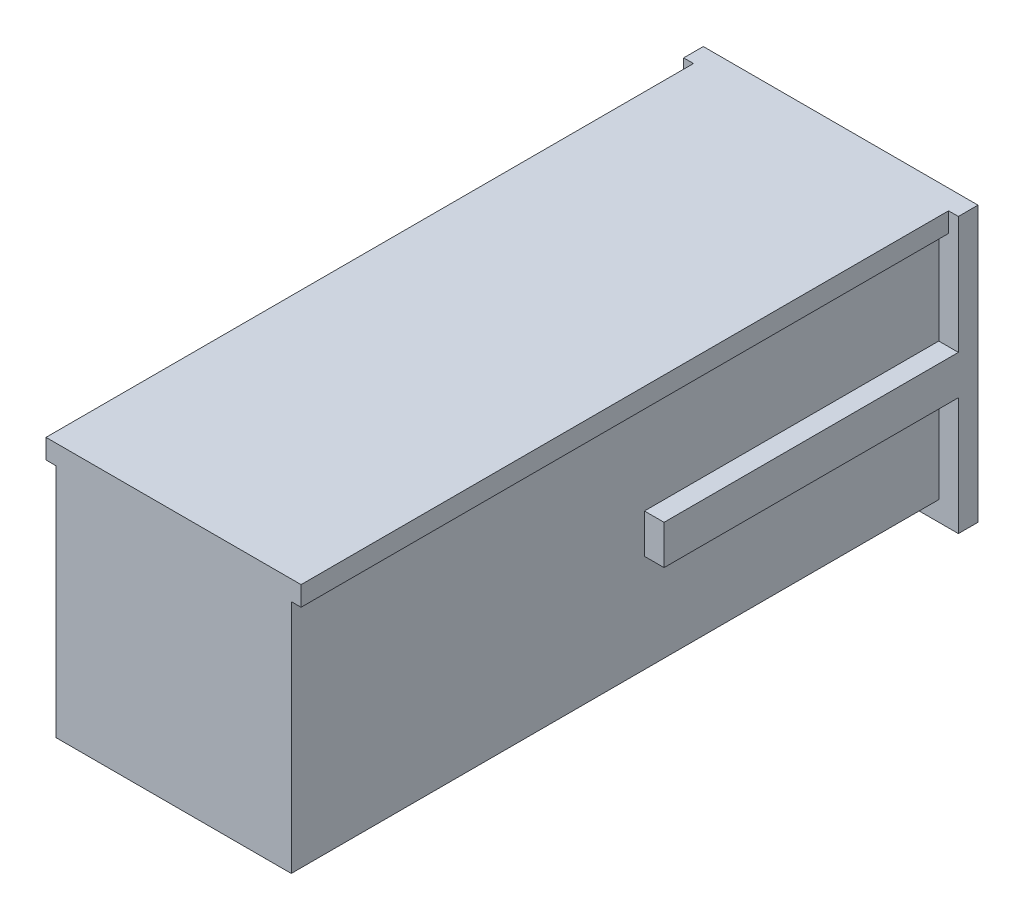
ISO-10303-21;
HEADER;
FILE_DESCRIPTION(('STEP AP214'),'2;1');
FILE_NAME('part.step','',(''),(''),'','','');
FILE_SCHEMA(('AUTOMOTIVE_DESIGN { 1 0 10303 214 1 1 1 1 }'));
ENDSEC;
DATA;
#1=APPLICATION_CONTEXT('core data for automotive mechanical design processes');
#2=APPLICATION_PROTOCOL_DEFINITION('international standard','automotive_design',2000,#1);
#3=PRODUCT_CONTEXT('',#1,'mechanical');
#4=PRODUCT('Part','Part','',(#3));
#5=PRODUCT_RELATED_PRODUCT_CATEGORY('part','',(#4));
#6=PRODUCT_DEFINITION_FORMATION('','',#4);
#7=PRODUCT_DEFINITION_CONTEXT('part definition',#1,'design');
#8=PRODUCT_DEFINITION('design','',#6,#7);
#9=PRODUCT_DEFINITION_SHAPE('','',#8);
#10=(LENGTH_UNIT() NAMED_UNIT(*) SI_UNIT(.MILLI.,.METRE.));
#11=(NAMED_UNIT(*) PLANE_ANGLE_UNIT() SI_UNIT($,.RADIAN.));
#12=(NAMED_UNIT(*) SI_UNIT($,.STERADIAN.) SOLID_ANGLE_UNIT());
#13=UNCERTAINTY_MEASURE_WITH_UNIT(LENGTH_MEASURE(1.E-05),#10,'distance_accuracy_value','');
#14=(GEOMETRIC_REPRESENTATION_CONTEXT(3) GLOBAL_UNCERTAINTY_ASSIGNED_CONTEXT((#13)) GLOBAL_UNIT_ASSIGNED_CONTEXT((#10,
#11,#12)) REPRESENTATION_CONTEXT('',''));
#15=CARTESIAN_POINT('',(0.,0.,0.));
#16=DIRECTION('',(0.,0.,1.));
#17=DIRECTION('',(1.,0.,0.));
#18=AXIS2_PLACEMENT_3D('',#15,#16,#17);
#19=CARTESIAN_POINT('',(300.,-300.,1700.));
#20=DIRECTION('',(-1.,0.,0.));
#21=DIRECTION('',(0.,0.,1.));
#22=AXIS2_PLACEMENT_3D('',#19,#20,#21);
#23=PLANE('',#22);
#24=DIRECTION('',(0.,-1.,0.));
#25=VECTOR('',#24,1.);
#26=CARTESIAN_POINT('',(300.,-300.,50.));
#27=LINE('',#26,#25);
#28=CARTESIAN_POINT('',(300.,300.,50.));
#29=VERTEX_POINT('',#28);
#30=CARTESIAN_POINT('',(300.,50.,50.));
#31=VERTEX_POINT('',#30);
#32=EDGE_CURVE('E189',#29,#31,#27,.T.);
#33=ORIENTED_EDGE('',*,*,#32,.F.);
#34=DIRECTION('',(0.,0.,-1.));
#35=VECTOR('',#34,1.);
#36=CARTESIAN_POINT('',(300.,300.,1700.));
#37=LINE('',#36,#35);
#38=CARTESIAN_POINT('',(300.,300.,1700.));
#39=VERTEX_POINT('',#38);
#40=EDGE_CURVE('E48',#39,#29,#37,.T.);
#41=ORIENTED_EDGE('',*,*,#40,.F.);
#42=DIRECTION('',(0.,1.,0.));
#43=VECTOR('',#42,1.);
#44=CARTESIAN_POINT('',(300.,-300.,1700.));
#45=LINE('',#44,#43);
#46=CARTESIAN_POINT('',(300.,-300.,1700.));
#47=VERTEX_POINT('',#46);
#48=EDGE_CURVE('E254',#47,#39,#45,.T.);
#49=ORIENTED_EDGE('',*,*,#48,.F.);
#50=DIRECTION('',(0.,0.,-1.));
#51=VECTOR('',#50,1.);
#52=CARTESIAN_POINT('',(300.,-300.,1700.));
#53=LINE('',#52,#51);
#54=CARTESIAN_POINT('',(300.,-300.,50.));
#55=VERTEX_POINT('',#54);
#56=EDGE_CURVE('E260',#47,#55,#53,.T.);
#57=ORIENTED_EDGE('',*,*,#56,.T.);
#58=CARTESIAN_POINT('',(300.,-50.,50.));
#59=VERTEX_POINT('',#58);
#60=EDGE_CURVE('E184',#59,#55,#27,.T.);
#61=ORIENTED_EDGE('',*,*,#60,.F.);
#62=DIRECTION('',(0.,0.,-1.));
#63=VECTOR('',#62,1.);
#64=CARTESIAN_POINT('',(300.,-50.,800.));
#65=LINE('',#64,#63);
#66=CARTESIAN_POINT('',(300.,-50.,800.));
#67=VERTEX_POINT('',#66);
#68=EDGE_CURVE('E224',#67,#59,#65,.T.);
#69=ORIENTED_EDGE('',*,*,#68,.F.);
#70=DIRECTION('',(0.,-1.,0.));
#71=VECTOR('',#70,1.);
#72=CARTESIAN_POINT('',(300.,-50.,800.));
#73=LINE('',#72,#71);
#74=CARTESIAN_POINT('',(300.,50.,800.));
#75=VERTEX_POINT('',#74);
#76=EDGE_CURVE('E215',#75,#67,#73,.T.);
#77=ORIENTED_EDGE('',*,*,#76,.F.);
#78=DIRECTION('',(0.,0.,-1.));
#79=VECTOR('',#78,1.);
#80=CARTESIAN_POINT('',(300.,50.,800.));
#81=LINE('',#80,#79);
#82=EDGE_CURVE('E227',#75,#31,#81,.T.);
#83=ORIENTED_EDGE('',*,*,#82,.T.);
#84=EDGE_LOOP('',(#33,#41,#49,#57,#61,#69,#77,#83));
#85=FACE_BOUND('',#84,.T.);
#86=ADVANCED_FACE('F41',(#85),#23,.F.);
#87=CARTESIAN_POINT('',(-300.,-300.,1700.));
#88=DIRECTION('',(1.,0.,0.));
#89=DIRECTION('',(0.,0.,-1.));
#90=AXIS2_PLACEMENT_3D('',#87,#88,#89);
#91=PLANE('',#90);
#92=DIRECTION('',(0.,1.,0.));
#93=VECTOR('',#92,1.);
#94=CARTESIAN_POINT('',(-300.,-300.,50.));
#95=LINE('',#94,#93);
#96=CARTESIAN_POINT('',(-300.,-300.,50.));
#97=VERTEX_POINT('',#96);
#98=CARTESIAN_POINT('',(-300.,300.,50.));
#99=VERTEX_POINT('',#98);
#100=EDGE_CURVE('E55',#97,#99,#95,.T.);
#101=ORIENTED_EDGE('',*,*,#100,.F.);
#102=DIRECTION('',(0.,0.,-1.));
#103=VECTOR('',#102,1.);
#104=CARTESIAN_POINT('',(-300.,-300.,1700.));
#105=LINE('',#104,#103);
#106=CARTESIAN_POINT('',(-300.,-300.,1700.));
#107=VERTEX_POINT('',#106);
#108=EDGE_CURVE('E262',#107,#97,#105,.T.);
#109=ORIENTED_EDGE('',*,*,#108,.F.);
#110=DIRECTION('',(0.,-1.,0.));
#111=VECTOR('',#110,1.);
#112=CARTESIAN_POINT('',(-300.,-300.,1700.));
#113=LINE('',#112,#111);
#114=CARTESIAN_POINT('',(-300.,300.,1700.));
#115=VERTEX_POINT('',#114);
#116=EDGE_CURVE('E256',#115,#107,#113,.T.);
#117=ORIENTED_EDGE('',*,*,#116,.F.);
#118=DIRECTION('',(0.,0.,-1.));
#119=VECTOR('',#118,1.);
#120=CARTESIAN_POINT('',(-300.,300.,1700.));
#121=LINE('',#120,#119);
#122=EDGE_CURVE('E264',#115,#99,#121,.T.);
#123=ORIENTED_EDGE('',*,*,#122,.T.);
#124=EDGE_LOOP('',(#101,#109,#117,#123));
#125=FACE_BOUND('',#124,.T.);
#126=ADVANCED_FACE('F307',(#125),#91,.F.);
#127=CARTESIAN_POINT('',(-300.,-300.,1700.));
#128=DIRECTION('',(0.,1.,0.));
#129=DIRECTION('',(0.,0.,1.));
#130=AXIS2_PLACEMENT_3D('',#127,#128,#129);
#131=PLANE('',#130);
#132=DIRECTION('',(-1.,0.,0.));
#133=VECTOR('',#132,1.);
#134=CARTESIAN_POINT('',(-300.,-300.,50.));
#135=LINE('',#134,#133);
#136=EDGE_CURVE('E62',#55,#97,#135,.T.);
#137=ORIENTED_EDGE('',*,*,#136,.F.);
#138=ORIENTED_EDGE('',*,*,#56,.F.);
#139=DIRECTION('',(1.,0.,0.));
#140=VECTOR('',#139,1.);
#141=CARTESIAN_POINT('',(-300.,-300.,1700.));
#142=LINE('',#141,#140);
#143=EDGE_CURVE('E258',#107,#47,#142,.T.);
#144=ORIENTED_EDGE('',*,*,#143,.F.);
#145=ORIENTED_EDGE('',*,*,#108,.T.);
#146=EDGE_LOOP('',(#137,#138,#144,#145));
#147=FACE_BOUND('',#146,.T.);
#148=ADVANCED_FACE('F312',(#147),#131,.F.);
#149=CARTESIAN_POINT('',(-325.,300.,1700.));
#150=DIRECTION('',(0.,1.,0.));
#151=DIRECTION('',(0.,0.,1.));
#152=AXIS2_PLACEMENT_3D('',#149,#150,#151);
#153=PLANE('',#152);
#154=DIRECTION('',(-1.,0.,0.));
#155=VECTOR('',#154,1.);
#156=CARTESIAN_POINT('',(-325.,300.,50.));
#157=LINE('',#156,#155);
#158=CARTESIAN_POINT('',(325.,300.,50.));
#159=VERTEX_POINT('',#158);
#160=EDGE_CURVE('E204',#159,#29,#157,.T.);
#161=ORIENTED_EDGE('',*,*,#160,.F.);
#162=DIRECTION('',(0.,0.,-1.));
#163=VECTOR('',#162,1.);
#164=CARTESIAN_POINT('',(325.,300.,1700.));
#165=LINE('',#164,#163);
#166=CARTESIAN_POINT('',(325.,300.,1700.));
#167=VERTEX_POINT('',#166);
#168=EDGE_CURVE('E244',#167,#159,#165,.T.);
#169=ORIENTED_EDGE('',*,*,#168,.F.);
#170=DIRECTION('',(1.,0.,0.));
#171=VECTOR('',#170,1.);
#172=CARTESIAN_POINT('',(-325.,300.,1700.));
#173=LINE('',#172,#171);
#174=EDGE_CURVE('E240',#39,#167,#173,.T.);
#175=ORIENTED_EDGE('',*,*,#174,.F.);
#176=ORIENTED_EDGE('',*,*,#40,.T.);
#177=EDGE_LOOP('',(#161,#169,#175,#176));
#178=FACE_BOUND('',#177,.T.);
#179=ADVANCED_FACE('F269',(#178),#153,.F.);
#180=CARTESIAN_POINT('',(325.,300.,1700.));
#181=DIRECTION('',(-1.,0.,0.));
#182=DIRECTION('',(0.,0.,1.));
#183=AXIS2_PLACEMENT_3D('',#180,#181,#182);
#184=PLANE('',#183);
#185=DIRECTION('',(0.,-1.,0.));
#186=VECTOR('',#185,1.);
#187=CARTESIAN_POINT('',(325.,300.,50.));
#188=LINE('',#187,#186);
#189=CARTESIAN_POINT('',(325.,350.,50.));
#190=VERTEX_POINT('',#189);
#191=EDGE_CURVE('E207',#190,#159,#188,.T.);
#192=ORIENTED_EDGE('',*,*,#191,.F.);
#193=DIRECTION('',(0.,0.,-1.));
#194=VECTOR('',#193,1.);
#195=CARTESIAN_POINT('',(325.,350.,1700.));
#196=LINE('',#195,#194);
#197=CARTESIAN_POINT('',(325.,350.,1700.));
#198=VERTEX_POINT('',#197);
#199=EDGE_CURVE('E176',#198,#190,#196,.T.);
#200=ORIENTED_EDGE('',*,*,#199,.F.);
#201=DIRECTION('',(0.,1.,0.));
#202=VECTOR('',#201,1.);
#203=CARTESIAN_POINT('',(325.,300.,1700.));
#204=LINE('',#203,#202);
#205=EDGE_CURVE('E233',#167,#198,#204,.T.);
#206=ORIENTED_EDGE('',*,*,#205,.F.);
#207=ORIENTED_EDGE('',*,*,#168,.T.);
#208=EDGE_LOOP('',(#192,#200,#206,#207));
#209=FACE_BOUND('',#208,.T.);
#210=ADVANCED_FACE('F274',(#209),#184,.F.);
#211=CARTESIAN_POINT('',(-325.,300.,1700.));
#212=DIRECTION('',(1.,0.,0.));
#213=DIRECTION('',(0.,0.,-1.));
#214=AXIS2_PLACEMENT_3D('',#211,#212,#213);
#215=PLANE('',#214);
#216=DIRECTION('',(0.,1.,0.));
#217=VECTOR('',#216,1.);
#218=CARTESIAN_POINT('',(-325.,300.,50.));
#219=LINE('',#218,#217);
#220=CARTESIAN_POINT('',(-325.,300.,50.));
#221=VERTEX_POINT('',#220);
#222=CARTESIAN_POINT('',(-325.,350.,50.));
#223=VERTEX_POINT('',#222);
#224=EDGE_CURVE('E200',#221,#223,#219,.T.);
#225=ORIENTED_EDGE('',*,*,#224,.F.);
#226=DIRECTION('',(0.,0.,-1.));
#227=VECTOR('',#226,1.);
#228=CARTESIAN_POINT('',(-325.,300.,1700.));
#229=LINE('',#228,#227);
#230=CARTESIAN_POINT('',(-325.,300.,1700.));
#231=VERTEX_POINT('',#230);
#232=EDGE_CURVE('E248',#231,#221,#229,.T.);
#233=ORIENTED_EDGE('',*,*,#232,.F.);
#234=DIRECTION('',(0.,-1.,0.));
#235=VECTOR('',#234,1.);
#236=CARTESIAN_POINT('',(-325.,300.,1700.));
#237=LINE('',#236,#235);
#238=CARTESIAN_POINT('',(-325.,350.,1700.));
#239=VERTEX_POINT('',#238);
#240=EDGE_CURVE('E238',#239,#231,#237,.T.);
#241=ORIENTED_EDGE('',*,*,#240,.F.);
#242=DIRECTION('',(0.,0.,-1.));
#243=VECTOR('',#242,1.);
#244=CARTESIAN_POINT('',(-325.,350.,1700.));
#245=LINE('',#244,#243);
#246=EDGE_CURVE('E251',#239,#223,#245,.T.);
#247=ORIENTED_EDGE('',*,*,#246,.T.);
#248=EDGE_LOOP('',(#225,#233,#241,#247));
#249=FACE_BOUND('',#248,.T.);
#250=ADVANCED_FACE('F302',(#249),#215,.F.);
#251=DIRECTION('',(-1.,0.,0.));
#252=VECTOR('',#251,1.);
#253=CARTESIAN_POINT('',(-325.,300.,50.));
#254=LINE('',#253,#252);
#255=EDGE_CURVE('E197',#99,#221,#254,.T.);
#256=ORIENTED_EDGE('',*,*,#255,.F.);
#257=ORIENTED_EDGE('',*,*,#122,.F.);
#258=EDGE_CURVE('E241',#231,#115,#173,.T.);
#259=ORIENTED_EDGE('',*,*,#258,.F.);
#260=ORIENTED_EDGE('',*,*,#232,.T.);
#261=EDGE_LOOP('',(#256,#257,#259,#260));
#262=FACE_BOUND('',#261,.T.);
#263=ADVANCED_FACE('F295',(#262),#153,.F.);
#264=CARTESIAN_POINT('',(300.,50.,800.));
#265=DIRECTION('',(0.,-1.,0.));
#266=DIRECTION('',(0.,0.,-1.));
#267=AXIS2_PLACEMENT_3D('',#264,#265,#266);
#268=PLANE('',#267);
#269=DIRECTION('',(1.,0.,0.));
#270=VECTOR('',#269,1.);
#271=CARTESIAN_POINT('',(300.,50.,50.));
#272=LINE('',#271,#270);
#273=CARTESIAN_POINT('',(350.,50.,50.));
#274=VERTEX_POINT('',#273);
#275=EDGE_CURVE('E163',#31,#274,#272,.T.);
#276=ORIENTED_EDGE('',*,*,#275,.F.);
#277=ORIENTED_EDGE('',*,*,#82,.F.);
#278=DIRECTION('',(-1.,0.,0.));
#279=VECTOR('',#278,1.);
#280=CARTESIAN_POINT('',(300.,50.,800.));
#281=LINE('',#280,#279);
#282=CARTESIAN_POINT('',(350.,50.,800.));
#283=VERTEX_POINT('',#282);
#284=EDGE_CURVE('E212',#283,#75,#281,.T.);
#285=ORIENTED_EDGE('',*,*,#284,.F.);
#286=DIRECTION('',(0.,0.,-1.));
#287=VECTOR('',#286,1.);
#288=CARTESIAN_POINT('',(350.,50.,800.));
#289=LINE('',#288,#287);
#290=EDGE_CURVE('E230',#283,#274,#289,.T.);
#291=ORIENTED_EDGE('',*,*,#290,.T.);
#292=EDGE_LOOP('',(#276,#277,#285,#291));
#293=FACE_BOUND('',#292,.T.);
#294=ADVANCED_FACE('F293',(#293),#268,.F.);
#295=CARTESIAN_POINT('',(300.,-50.,800.));
#296=DIRECTION('',(0.,1.,0.));
#297=DIRECTION('',(0.,0.,1.));
#298=AXIS2_PLACEMENT_3D('',#295,#296,#297);
#299=PLANE('',#298);
#300=DIRECTION('',(-1.,0.,0.));
#301=VECTOR('',#300,1.);
#302=CARTESIAN_POINT('',(300.,-50.,50.));
#303=LINE('',#302,#301);
#304=CARTESIAN_POINT('',(350.,-50.,50.));
#305=VERTEX_POINT('',#304);
#306=EDGE_CURVE('E11',#305,#59,#303,.T.);
#307=ORIENTED_EDGE('',*,*,#306,.F.);
#308=DIRECTION('',(0.,0.,-1.));
#309=VECTOR('',#308,1.);
#310=CARTESIAN_POINT('',(350.,-50.,800.));
#311=LINE('',#310,#309);
#312=CARTESIAN_POINT('',(350.,-50.,800.));
#313=VERTEX_POINT('',#312);
#314=EDGE_CURVE('E220',#313,#305,#311,.T.);
#315=ORIENTED_EDGE('',*,*,#314,.F.);
#316=DIRECTION('',(1.,0.,0.));
#317=VECTOR('',#316,1.);
#318=CARTESIAN_POINT('',(300.,-50.,800.));
#319=LINE('',#318,#317);
#320=EDGE_CURVE('E218',#67,#313,#319,.T.);
#321=ORIENTED_EDGE('',*,*,#320,.F.);
#322=ORIENTED_EDGE('',*,*,#68,.T.);
#323=EDGE_LOOP('',(#307,#315,#321,#322));
#324=FACE_BOUND('',#323,.T.);
#325=ADVANCED_FACE('F286',(#324),#299,.F.);
#326=CARTESIAN_POINT('',(0.,0.,1700.));
#327=DIRECTION('',(0.,0.,-1.));
#328=DIRECTION('',(-1.,0.,0.));
#329=AXIS2_PLACEMENT_3D('',#326,#327,#328);
#330=PLANE('',#329);
#331=ORIENTED_EDGE('',*,*,#48,.T.);
#332=ORIENTED_EDGE('',*,*,#174,.T.);
#333=ORIENTED_EDGE('',*,*,#205,.T.);
#334=DIRECTION('',(-1.,0.,0.));
#335=VECTOR('',#334,1.);
#336=CARTESIAN_POINT('',(-325.,350.,1700.));
#337=LINE('',#336,#335);
#338=EDGE_CURVE('E236',#198,#239,#337,.T.);
#339=ORIENTED_EDGE('',*,*,#338,.T.);
#340=ORIENTED_EDGE('',*,*,#240,.T.);
#341=ORIENTED_EDGE('',*,*,#258,.T.);
#342=ORIENTED_EDGE('',*,*,#116,.T.);
#343=ORIENTED_EDGE('',*,*,#143,.T.);
#344=EDGE_LOOP('',(#331,#332,#333,#339,#340,#341,#342,#343));
#345=FACE_BOUND('',#344,.T.);
#346=ADVANCED_FACE('F277',(#345),#330,.F.);
#347=CARTESIAN_POINT('',(0.,0.,0.));
#348=DIRECTION('',(0.,0.,-1.));
#349=DIRECTION('',(-1.,0.,0.));
#350=AXIS2_PLACEMENT_3D('',#347,#348,#349);
#351=PLANE('',#350);
#352=DIRECTION('',(-1.,0.,0.));
#353=VECTOR('',#352,1.);
#354=CARTESIAN_POINT('',(-325.,350.,0.));
#355=LINE('',#354,#353);
#356=CARTESIAN_POINT('',(350.,350.,0.));
#357=VERTEX_POINT('',#356);
#358=CARTESIAN_POINT('',(-350.,350.,0.));
#359=VERTEX_POINT('',#358);
#360=EDGE_CURVE('E232',#357,#359,#355,.T.);
#361=ORIENTED_EDGE('',*,*,#360,.F.);
#362=DIRECTION('',(0.,1.,0.));
#363=VECTOR('',#362,1.);
#364=CARTESIAN_POINT('',(350.,-50.,0.));
#365=LINE('',#364,#363);
#366=CARTESIAN_POINT('',(350.,-350.,0.));
#367=VERTEX_POINT('',#366);
#368=EDGE_CURVE('E183',#367,#357,#365,.T.);
#369=ORIENTED_EDGE('',*,*,#368,.F.);
#370=DIRECTION('',(1.,0.,0.));
#371=VECTOR('',#370,1.);
#372=CARTESIAN_POINT('',(-350.,-350.,0.));
#373=LINE('',#372,#371);
#374=CARTESIAN_POINT('',(-350.,-350.,0.));
#375=VERTEX_POINT('',#374);
#376=EDGE_CURVE('E168',#375,#367,#373,.T.);
#377=ORIENTED_EDGE('',*,*,#376,.F.);
#378=DIRECTION('',(0.,-1.,0.));
#379=VECTOR('',#378,1.);
#380=CARTESIAN_POINT('',(-350.,-350.,0.));
#381=LINE('',#380,#379);
#382=EDGE_CURVE('E466',#359,#375,#381,.T.);
#383=ORIENTED_EDGE('',*,*,#382,.F.);
#384=EDGE_LOOP('',(#361,#369,#377,#383));
#385=FACE_BOUND('',#384,.T.);
#386=ADVANCED_FACE('F318',(#385),#351,.T.);
#387=CARTESIAN_POINT('',(-325.,350.,1700.));
#388=DIRECTION('',(0.,-1.,0.));
#389=DIRECTION('',(0.,0.,-1.));
#390=AXIS2_PLACEMENT_3D('',#387,#388,#389);
#391=PLANE('',#390);
#392=ORIENTED_EDGE('',*,*,#360,.T.);
#393=DIRECTION('',(0.,0.,-1.));
#394=VECTOR('',#393,1.);
#395=CARTESIAN_POINT('',(-350.,350.,50.));
#396=LINE('',#395,#394);
#397=CARTESIAN_POINT('',(-350.,350.,50.));
#398=VERTEX_POINT('',#397);
#399=EDGE_CURVE('E185',#398,#359,#396,.T.);
#400=ORIENTED_EDGE('',*,*,#399,.F.);
#401=DIRECTION('',(-1.,0.,0.));
#402=VECTOR('',#401,1.);
#403=CARTESIAN_POINT('',(-350.,350.,50.));
#404=LINE('',#403,#402);
#405=EDGE_CURVE('E178',#223,#398,#404,.T.);
#406=ORIENTED_EDGE('',*,*,#405,.F.);
#407=ORIENTED_EDGE('',*,*,#246,.F.);
#408=ORIENTED_EDGE('',*,*,#338,.F.);
#409=ORIENTED_EDGE('',*,*,#199,.T.);
#410=CARTESIAN_POINT('',(350.,350.,50.));
#411=VERTEX_POINT('',#410);
#412=EDGE_CURVE('E161',#411,#190,#404,.T.);
#413=ORIENTED_EDGE('',*,*,#412,.F.);
#414=DIRECTION('',(0.,0.,-1.));
#415=VECTOR('',#414,1.);
#416=CARTESIAN_POINT('',(350.,350.,50.));
#417=LINE('',#416,#415);
#418=EDGE_CURVE('E174',#411,#357,#417,.T.);
#419=ORIENTED_EDGE('',*,*,#418,.T.);
#420=EDGE_LOOP('',(#392,#400,#406,#407,#408,#409,#413,#419));
#421=FACE_BOUND('',#420,.T.);
#422=ADVANCED_FACE('F173',(#421),#391,.F.);
#423=CARTESIAN_POINT('',(350.,-50.,800.));
#424=DIRECTION('',(-1.,0.,0.));
#425=DIRECTION('',(0.,0.,1.));
#426=AXIS2_PLACEMENT_3D('',#423,#424,#425);
#427=PLANE('',#426);
#428=ORIENTED_EDGE('',*,*,#368,.T.);
#429=ORIENTED_EDGE('',*,*,#418,.F.);
#430=DIRECTION('',(0.,1.,0.));
#431=VECTOR('',#430,1.);
#432=CARTESIAN_POINT('',(350.,-350.,50.));
#433=LINE('',#432,#431);
#434=EDGE_CURVE('E157',#274,#411,#433,.T.);
#435=ORIENTED_EDGE('',*,*,#434,.F.);
#436=ORIENTED_EDGE('',*,*,#290,.F.);
#437=DIRECTION('',(0.,1.,0.));
#438=VECTOR('',#437,1.);
#439=CARTESIAN_POINT('',(350.,-50.,800.));
#440=LINE('',#439,#438);
#441=EDGE_CURVE('E209',#313,#283,#440,.T.);
#442=ORIENTED_EDGE('',*,*,#441,.F.);
#443=ORIENTED_EDGE('',*,*,#314,.T.);
#444=CARTESIAN_POINT('',(350.,-350.,50.));
#445=VERTEX_POINT('',#444);
#446=EDGE_CURVE('E167',#445,#305,#433,.T.);
#447=ORIENTED_EDGE('',*,*,#446,.F.);
#448=DIRECTION('',(0.,0.,-1.));
#449=VECTOR('',#448,1.);
#450=CARTESIAN_POINT('',(350.,-350.,50.));
#451=LINE('',#450,#449);
#452=EDGE_CURVE('E476',#445,#367,#451,.T.);
#453=ORIENTED_EDGE('',*,*,#452,.T.);
#454=EDGE_LOOP('',(#428,#429,#435,#436,#442,#443,#447,#453));
#455=FACE_BOUND('',#454,.T.);
#456=ADVANCED_FACE('F181',(#455),#427,.F.);
#457=CARTESIAN_POINT('',(0.,0.,800.));
#458=DIRECTION('',(0.,0.,-1.));
#459=DIRECTION('',(-1.,0.,0.));
#460=AXIS2_PLACEMENT_3D('',#457,#458,#459);
#461=PLANE('',#460);
#462=ORIENTED_EDGE('',*,*,#441,.T.);
#463=ORIENTED_EDGE('',*,*,#284,.T.);
#464=ORIENTED_EDGE('',*,*,#76,.T.);
#465=ORIENTED_EDGE('',*,*,#320,.T.);
#466=EDGE_LOOP('',(#462,#463,#464,#465));
#467=FACE_BOUND('',#466,.T.);
#468=ADVANCED_FACE('F290',(#467),#461,.F.);
#469=CARTESIAN_POINT('',(-350.,-350.,50.));
#470=DIRECTION('',(0.,1.,0.));
#471=DIRECTION('',(0.,0.,1.));
#472=AXIS2_PLACEMENT_3D('',#469,#470,#471);
#473=PLANE('',#472);
#474=ORIENTED_EDGE('',*,*,#376,.T.);
#475=ORIENTED_EDGE('',*,*,#452,.F.);
#476=DIRECTION('',(1.,0.,0.));
#477=VECTOR('',#476,1.);
#478=CARTESIAN_POINT('',(-350.,-350.,50.));
#479=LINE('',#478,#477);
#480=CARTESIAN_POINT('',(-350.,-350.,50.));
#481=VERTEX_POINT('',#480);
#482=EDGE_CURVE('E475',#481,#445,#479,.T.);
#483=ORIENTED_EDGE('',*,*,#482,.F.);
#484=DIRECTION('',(0.,0.,-1.));
#485=VECTOR('',#484,1.);
#486=CARTESIAN_POINT('',(-350.,-350.,50.));
#487=LINE('',#486,#485);
#488=EDGE_CURVE('E191',#481,#375,#487,.T.);
#489=ORIENTED_EDGE('',*,*,#488,.T.);
#490=EDGE_LOOP('',(#474,#475,#483,#489));
#491=FACE_BOUND('',#490,.T.);
#492=ADVANCED_FACE('F335',(#491),#473,.F.);
#493=CARTESIAN_POINT('',(-350.,-350.,50.));
#494=DIRECTION('',(1.,0.,0.));
#495=DIRECTION('',(0.,0.,-1.));
#496=AXIS2_PLACEMENT_3D('',#493,#494,#495);
#497=PLANE('',#496);
#498=ORIENTED_EDGE('',*,*,#382,.T.);
#499=ORIENTED_EDGE('',*,*,#488,.F.);
#500=DIRECTION('',(0.,-1.,0.));
#501=VECTOR('',#500,1.);
#502=CARTESIAN_POINT('',(-350.,-350.,50.));
#503=LINE('',#502,#501);
#504=EDGE_CURVE('E177',#398,#481,#503,.T.);
#505=ORIENTED_EDGE('',*,*,#504,.F.);
#506=ORIENTED_EDGE('',*,*,#399,.T.);
#507=EDGE_LOOP('',(#498,#499,#505,#506));
#508=FACE_BOUND('',#507,.T.);
#509=ADVANCED_FACE('F339',(#508),#497,.F.);
#510=CARTESIAN_POINT('',(0.,0.,50.));
#511=DIRECTION('',(0.,0.,-1.));
#512=DIRECTION('',(-1.,0.,0.));
#513=AXIS2_PLACEMENT_3D('',#510,#511,#512);
#514=PLANE('',#513);
#515=ORIENTED_EDGE('',*,*,#255,.T.);
#516=ORIENTED_EDGE('',*,*,#224,.T.);
#517=ORIENTED_EDGE('',*,*,#405,.T.);
#518=ORIENTED_EDGE('',*,*,#504,.T.);
#519=ORIENTED_EDGE('',*,*,#482,.T.);
#520=ORIENTED_EDGE('',*,*,#446,.T.);
#521=ORIENTED_EDGE('',*,*,#306,.T.);
#522=ORIENTED_EDGE('',*,*,#60,.T.);
#523=ORIENTED_EDGE('',*,*,#136,.T.);
#524=ORIENTED_EDGE('',*,*,#100,.T.);
#525=EDGE_LOOP('',(#515,#516,#517,#518,#519,#520,#521,#522,#523,#524));
#526=FACE_BOUND('',#525,.T.);
#527=ADVANCED_FACE('F281',(#526),#514,.F.);
#528=ORIENTED_EDGE('',*,*,#412,.T.);
#529=ORIENTED_EDGE('',*,*,#191,.T.);
#530=ORIENTED_EDGE('',*,*,#160,.T.);
#531=ORIENTED_EDGE('',*,*,#32,.T.);
#532=ORIENTED_EDGE('',*,*,#275,.T.);
#533=ORIENTED_EDGE('',*,*,#434,.T.);
#534=EDGE_LOOP('',(#528,#529,#530,#531,#532,#533));
#535=FACE_BOUND('',#534,.T.);
#536=ADVANCED_FACE('F159',(#535),#514,.F.);
#537=CLOSED_SHELL('',(#86,#126,#148,#179,#210,#250,#263,#294,#325,#346,#386,#422,#456,#468,#492,
#509,#527,#536));
#538=MANIFOLD_SOLID_BREP('B2',#537);
#539=ADVANCED_BREP_SHAPE_REPRESENTATION('',(#18,#538),#14);
#540=SHAPE_DEFINITION_REPRESENTATION(#9,#539);
ENDSEC;
END-ISO-10303-21;
